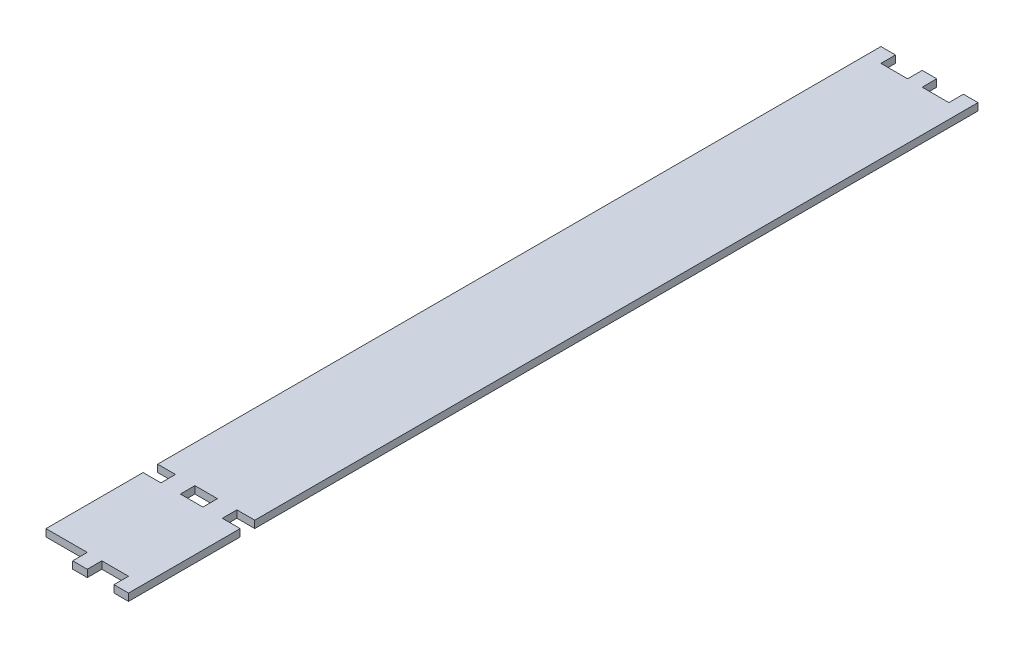
ISO-10303-21;
HEADER;
FILE_DESCRIPTION(('STEP AP214'),'2;1');
FILE_NAME('part.step','',(''),(''),'','','');
FILE_SCHEMA(('AUTOMOTIVE_DESIGN { 1 0 10303 214 1 1 1 1 }'));
ENDSEC;
DATA;
#1=APPLICATION_CONTEXT('core data for automotive mechanical design processes');
#2=APPLICATION_PROTOCOL_DEFINITION('international standard','automotive_design',2000,#1);
#3=PRODUCT_CONTEXT('',#1,'mechanical');
#4=PRODUCT('Part','Part','',(#3));
#5=PRODUCT_RELATED_PRODUCT_CATEGORY('part','',(#4));
#6=PRODUCT_DEFINITION_FORMATION('','',#4);
#7=PRODUCT_DEFINITION_CONTEXT('part definition',#1,'design');
#8=PRODUCT_DEFINITION('design','',#6,#7);
#9=PRODUCT_DEFINITION_SHAPE('','',#8);
#10=(LENGTH_UNIT() NAMED_UNIT(*) SI_UNIT(.MILLI.,.METRE.));
#11=(NAMED_UNIT(*) PLANE_ANGLE_UNIT() SI_UNIT($,.RADIAN.));
#12=(NAMED_UNIT(*) SI_UNIT($,.STERADIAN.) SOLID_ANGLE_UNIT());
#13=UNCERTAINTY_MEASURE_WITH_UNIT(LENGTH_MEASURE(1.E-05),#10,'distance_accuracy_value','');
#14=(GEOMETRIC_REPRESENTATION_CONTEXT(3) GLOBAL_UNCERTAINTY_ASSIGNED_CONTEXT((#13)) GLOBAL_UNIT_ASSIGNED_CONTEXT((#10,
#11,#12)) REPRESENTATION_CONTEXT('',''));
#15=CARTESIAN_POINT('',(0.,0.,0.));
#16=DIRECTION('',(0.,0.,1.));
#17=DIRECTION('',(1.,0.,0.));
#18=AXIS2_PLACEMENT_3D('',#15,#16,#17);
#19=CARTESIAN_POINT('',(0.,0.,0.));
#20=DIRECTION('',(0.,0.,-1.));
#21=DIRECTION('',(-1.,0.,0.));
#22=AXIS2_PLACEMENT_3D('',#19,#20,#21);
#23=PLANE('',#22);
#24=DIRECTION('',(0.,-1.,0.));
#25=VECTOR('',#24,1.);
#26=CARTESIAN_POINT('',(34.,3.,0.));
#27=LINE('',#26,#25);
#28=CARTESIAN_POINT('',(34.,3.,0.));
#29=VERTEX_POINT('',#28);
#30=CARTESIAN_POINT('',(34.,0.,0.));
#31=VERTEX_POINT('',#30);
#32=EDGE_CURVE('E256',#29,#31,#27,.T.);
#33=ORIENTED_EDGE('',*,*,#32,.T.);
#34=DIRECTION('',(1.,0.,0.));
#35=VECTOR('',#34,1.);
#36=CARTESIAN_POINT('',(0.,0.,0.));
#37=LINE('',#36,#35);
#38=CARTESIAN_POINT('',(23.,0.,0.));
#39=VERTEX_POINT('',#38);
#40=EDGE_CURVE('E286',#39,#31,#37,.T.);
#41=ORIENTED_EDGE('',*,*,#40,.F.);
#42=DIRECTION('',(0.,1.,0.));
#43=VECTOR('',#42,1.);
#44=CARTESIAN_POINT('',(23.,3.,0.));
#45=LINE('',#44,#43);
#46=CARTESIAN_POINT('',(23.,3.,0.));
#47=VERTEX_POINT('',#46);
#48=EDGE_CURVE('E863',#39,#47,#45,.T.);
#49=ORIENTED_EDGE('',*,*,#48,.T.);
#50=DIRECTION('',(-1.,0.,0.));
#51=VECTOR('',#50,1.);
#52=CARTESIAN_POINT('',(0.,3.,0.));
#53=LINE('',#52,#51);
#54=EDGE_CURVE('E41',#29,#47,#53,.T.);
#55=ORIENTED_EDGE('',*,*,#54,.F.);
#56=EDGE_LOOP('',(#33,#41,#49,#55));
#57=FACE_BOUND('',#56,.T.);
#58=ADVANCED_FACE('F37',(#57),#23,.T.);
#59=DIRECTION('',(0.,-1.,0.));
#60=VECTOR('',#59,1.);
#61=CARTESIAN_POINT('',(17.,3.,0.));
#62=LINE('',#61,#60);
#63=CARTESIAN_POINT('',(17.,3.,0.));
#64=VERTEX_POINT('',#63);
#65=CARTESIAN_POINT('',(17.,0.,0.));
#66=VERTEX_POINT('',#65);
#67=EDGE_CURVE('E55',#64,#66,#62,.T.);
#68=ORIENTED_EDGE('',*,*,#67,.T.);
#69=CARTESIAN_POINT('',(6.,0.,0.));
#70=VERTEX_POINT('',#69);
#71=EDGE_CURVE('E283',#70,#66,#37,.T.);
#72=ORIENTED_EDGE('',*,*,#71,.F.);
#73=DIRECTION('',(0.,1.,0.));
#74=VECTOR('',#73,1.);
#75=CARTESIAN_POINT('',(6.,3.,0.));
#76=LINE('',#75,#74);
#77=CARTESIAN_POINT('',(6.,3.,0.));
#78=VERTEX_POINT('',#77);
#79=EDGE_CURVE('E287',#70,#78,#76,.T.);
#80=ORIENTED_EDGE('',*,*,#79,.T.);
#81=EDGE_CURVE('E62',#64,#78,#53,.T.);
#82=ORIENTED_EDGE('',*,*,#81,.F.);
#83=EDGE_LOOP('',(#68,#72,#80,#82));
#84=FACE_BOUND('',#83,.T.);
#85=ADVANCED_FACE('F491',(#84),#23,.T.);
#86=CARTESIAN_POINT('',(0.,0.,338.));
#87=DIRECTION('',(0.,0.,-1.));
#88=DIRECTION('',(-1.,0.,0.));
#89=AXIS2_PLACEMENT_3D('',#86,#87,#88);
#90=PLANE('',#89);
#91=DIRECTION('',(0.,-1.,0.));
#92=VECTOR('',#91,1.);
#93=CARTESIAN_POINT('',(34.,3.,338.));
#94=LINE('',#93,#92);
#95=CARTESIAN_POINT('',(34.,3.,338.));
#96=VERTEX_POINT('',#95);
#97=CARTESIAN_POINT('',(34.,0.,338.));
#98=VERTEX_POINT('',#97);
#99=EDGE_CURVE('E304',#96,#98,#94,.T.);
#100=ORIENTED_EDGE('',*,*,#99,.F.);
#101=DIRECTION('',(-1.,0.,0.));
#102=VECTOR('',#101,1.);
#103=CARTESIAN_POINT('',(0.,3.,338.));
#104=LINE('',#103,#102);
#105=CARTESIAN_POINT('',(23.,3.,338.));
#106=VERTEX_POINT('',#105);
#107=EDGE_CURVE('E280',#96,#106,#104,.T.);
#108=ORIENTED_EDGE('',*,*,#107,.T.);
#109=DIRECTION('',(0.,1.,0.));
#110=VECTOR('',#109,1.);
#111=CARTESIAN_POINT('',(23.,3.,338.));
#112=LINE('',#111,#110);
#113=CARTESIAN_POINT('',(23.,0.,338.));
#114=VERTEX_POINT('',#113);
#115=EDGE_CURVE('E327',#114,#106,#112,.T.);
#116=ORIENTED_EDGE('',*,*,#115,.F.);
#117=DIRECTION('',(1.,0.,0.));
#118=VECTOR('',#117,1.);
#119=CARTESIAN_POINT('',(0.,0.,338.));
#120=LINE('',#119,#118);
#121=EDGE_CURVE('E249',#114,#98,#120,.T.);
#122=ORIENTED_EDGE('',*,*,#121,.T.);
#123=EDGE_LOOP('',(#100,#108,#116,#122));
#124=FACE_BOUND('',#123,.T.);
#125=ADVANCED_FACE('F489',(#124),#90,.F.);
#126=DIRECTION('',(0.,-1.,0.));
#127=VECTOR('',#126,1.);
#128=CARTESIAN_POINT('',(17.,3.,338.));
#129=LINE('',#128,#127);
#130=CARTESIAN_POINT('',(17.,3.,338.));
#131=VERTEX_POINT('',#130);
#132=CARTESIAN_POINT('',(17.,0.,338.));
#133=VERTEX_POINT('',#132);
#134=EDGE_CURVE('E332',#131,#133,#129,.T.);
#135=ORIENTED_EDGE('',*,*,#134,.F.);
#136=CARTESIAN_POINT('',(0.,3.,338.));
#137=VERTEX_POINT('',#136);
#138=EDGE_CURVE('E248',#131,#137,#104,.T.);
#139=ORIENTED_EDGE('',*,*,#138,.T.);
#140=DIRECTION('',(0.,-1.,0.));
#141=VECTOR('',#140,1.);
#142=CARTESIAN_POINT('',(0.,6.,338.));
#143=LINE('',#142,#141);
#144=CARTESIAN_POINT('',(0.,0.,338.));
#145=VERTEX_POINT('',#144);
#146=EDGE_CURVE('E252',#137,#145,#143,.T.);
#147=ORIENTED_EDGE('',*,*,#146,.T.);
#148=EDGE_CURVE('E235',#145,#133,#120,.T.);
#149=ORIENTED_EDGE('',*,*,#148,.T.);
#150=EDGE_LOOP('',(#135,#139,#147,#149));
#151=FACE_BOUND('',#150,.T.);
#152=ADVANCED_FACE('F253',(#151),#90,.F.);
#153=CARTESIAN_POINT('',(0.,0.,338.));
#154=DIRECTION('',(0.,1.,0.));
#155=DIRECTION('',(0.,0.,1.));
#156=AXIS2_PLACEMENT_3D('',#153,#154,#155);
#157=PLANE('',#156);
#158=DIRECTION('',(0.,0.,1.));
#159=VECTOR('',#158,1.);
#160=CARTESIAN_POINT('',(24.65,0.,338.));
#161=LINE('',#160,#159);
#162=CARTESIAN_POINT('',(24.65,0.,292.));
#163=VERTEX_POINT('',#162);
#164=CARTESIAN_POINT('',(24.65,0.,298.));
#165=VERTEX_POINT('',#164);
#166=EDGE_CURVE('E400',#163,#165,#161,.T.);
#167=ORIENTED_EDGE('',*,*,#166,.F.);
#168=DIRECTION('',(1.,0.,0.));
#169=VECTOR('',#168,1.);
#170=CARTESIAN_POINT('',(0.,0.,292.));
#171=LINE('',#170,#169);
#172=CARTESIAN_POINT('',(15.35,0.,292.));
#173=VERTEX_POINT('',#172);
#174=EDGE_CURVE('E386',#173,#163,#171,.T.);
#175=ORIENTED_EDGE('',*,*,#174,.F.);
#176=DIRECTION('',(0.,0.,1.));
#177=VECTOR('',#176,1.);
#178=CARTESIAN_POINT('',(15.35,0.,338.));
#179=LINE('',#178,#177);
#180=CARTESIAN_POINT('',(15.35,0.,298.));
#181=VERTEX_POINT('',#180);
#182=EDGE_CURVE('E394',#173,#181,#179,.T.);
#183=ORIENTED_EDGE('',*,*,#182,.T.);
#184=DIRECTION('',(1.,0.,0.));
#185=VECTOR('',#184,1.);
#186=CARTESIAN_POINT('',(0.,0.,298.));
#187=LINE('',#186,#185);
#188=EDGE_CURVE('E397',#181,#165,#187,.T.);
#189=ORIENTED_EDGE('',*,*,#188,.T.);
#190=EDGE_LOOP('',(#167,#175,#183,#189));
#191=FACE_BOUND('',#190,.T.);
#192=ORIENTED_EDGE('',*,*,#148,.F.);
#193=DIRECTION('',(0.,0.,-1.));
#194=VECTOR('',#193,1.);
#195=CARTESIAN_POINT('',(0.,0.,338.));
#196=LINE('',#195,#194);
#197=CARTESIAN_POINT('',(0.,0.,298.));
#198=VERTEX_POINT('',#197);
#199=EDGE_CURVE('E240',#145,#198,#196,.T.);
#200=ORIENTED_EDGE('',*,*,#199,.T.);
#201=DIRECTION('',(1.,0.,0.));
#202=VECTOR('',#201,1.);
#203=CARTESIAN_POINT('',(0.,0.,298.));
#204=LINE('',#203,#202);
#205=CARTESIAN_POINT('',(7.35,0.,298.));
#206=VERTEX_POINT('',#205);
#207=EDGE_CURVE('E421',#198,#206,#204,.T.);
#208=ORIENTED_EDGE('',*,*,#207,.T.);
#209=DIRECTION('',(0.,0.,1.));
#210=VECTOR('',#209,1.);
#211=CARTESIAN_POINT('',(7.35,0.,338.));
#212=LINE('',#211,#210);
#213=CARTESIAN_POINT('',(7.35,0.,292.));
#214=VERTEX_POINT('',#213);
#215=EDGE_CURVE('E274',#214,#206,#212,.T.);
#216=ORIENTED_EDGE('',*,*,#215,.F.);
#217=DIRECTION('',(1.,0.,0.));
#218=VECTOR('',#217,1.);
#219=CARTESIAN_POINT('',(0.,0.,292.));
#220=LINE('',#219,#218);
#221=CARTESIAN_POINT('',(0.,0.,292.));
#222=VERTEX_POINT('',#221);
#223=EDGE_CURVE('E414',#222,#214,#220,.T.);
#224=ORIENTED_EDGE('',*,*,#223,.F.);
#225=CARTESIAN_POINT('',(0.,0.,-6.));
#226=VERTEX_POINT('',#225);
#227=EDGE_CURVE('E261',#222,#226,#196,.T.);
#228=ORIENTED_EDGE('',*,*,#227,.T.);
#229=DIRECTION('',(1.,0.,0.));
#230=VECTOR('',#229,1.);
#231=CARTESIAN_POINT('',(0.,0.,-6.));
#232=LINE('',#231,#230);
#233=CARTESIAN_POINT('',(6.,0.,-6.));
#234=VERTEX_POINT('',#233);
#235=EDGE_CURVE('E302',#226,#234,#232,.T.);
#236=ORIENTED_EDGE('',*,*,#235,.T.);
#237=DIRECTION('',(0.,0.,1.));
#238=VECTOR('',#237,1.);
#239=CARTESIAN_POINT('',(6.,0.,-6.));
#240=LINE('',#239,#238);
#241=EDGE_CURVE('E299',#234,#70,#240,.T.);
#242=ORIENTED_EDGE('',*,*,#241,.T.);
#243=ORIENTED_EDGE('',*,*,#71,.T.);
#244=DIRECTION('',(0.,0.,1.));
#245=VECTOR('',#244,1.);
#246=CARTESIAN_POINT('',(17.,0.,-6.));
#247=LINE('',#246,#245);
#248=CARTESIAN_POINT('',(17.,0.,-6.));
#249=VERTEX_POINT('',#248);
#250=EDGE_CURVE('E884',#249,#66,#247,.T.);
#251=ORIENTED_EDGE('',*,*,#250,.F.);
#252=DIRECTION('',(1.,0.,0.));
#253=VECTOR('',#252,1.);
#254=CARTESIAN_POINT('',(17.,0.,-6.));
#255=LINE('',#254,#253);
#256=CARTESIAN_POINT('',(23.,0.,-6.));
#257=VERTEX_POINT('',#256);
#258=EDGE_CURVE('E867',#249,#257,#255,.T.);
#259=ORIENTED_EDGE('',*,*,#258,.T.);
#260=DIRECTION('',(0.,0.,1.));
#261=VECTOR('',#260,1.);
#262=CARTESIAN_POINT('',(23.,0.,-6.));
#263=LINE('',#262,#261);
#264=EDGE_CURVE('E886',#257,#39,#263,.T.);
#265=ORIENTED_EDGE('',*,*,#264,.T.);
#266=ORIENTED_EDGE('',*,*,#40,.T.);
#267=DIRECTION('',(0.,0.,1.));
#268=VECTOR('',#267,1.);
#269=CARTESIAN_POINT('',(34.,0.,-6.));
#270=LINE('',#269,#268);
#271=CARTESIAN_POINT('',(34.,0.,-6.));
#272=VERTEX_POINT('',#271);
#273=EDGE_CURVE('E859',#272,#31,#270,.T.);
#274=ORIENTED_EDGE('',*,*,#273,.F.);
#275=DIRECTION('',(1.,0.,0.));
#276=VECTOR('',#275,1.);
#277=CARTESIAN_POINT('',(34.,0.,-6.));
#278=LINE('',#277,#276);
#279=CARTESIAN_POINT('',(40.,0.,-6.));
#280=VERTEX_POINT('',#279);
#281=EDGE_CURVE('E849',#272,#280,#278,.T.);
#282=ORIENTED_EDGE('',*,*,#281,.T.);
#283=DIRECTION('',(0.,0.,-1.));
#284=VECTOR('',#283,1.);
#285=CARTESIAN_POINT('',(40.,0.,338.));
#286=LINE('',#285,#284);
#287=CARTESIAN_POINT('',(40.,0.,292.));
#288=VERTEX_POINT('',#287);
#289=EDGE_CURVE('E475',#288,#280,#286,.T.);
#290=ORIENTED_EDGE('',*,*,#289,.F.);
#291=DIRECTION('',(1.,0.,0.));
#292=VECTOR('',#291,1.);
#293=CARTESIAN_POINT('',(0.,0.,292.));
#294=LINE('',#293,#292);
#295=CARTESIAN_POINT('',(32.65,0.,292.));
#296=VERTEX_POINT('',#295);
#297=EDGE_CURVE('E366',#296,#288,#294,.T.);
#298=ORIENTED_EDGE('',*,*,#297,.F.);
#299=DIRECTION('',(0.,0.,1.));
#300=VECTOR('',#299,1.);
#301=CARTESIAN_POINT('',(32.65,0.,338.));
#302=LINE('',#301,#300);
#303=CARTESIAN_POINT('',(32.65,0.,298.));
#304=VERTEX_POINT('',#303);
#305=EDGE_CURVE('E368',#296,#304,#302,.T.);
#306=ORIENTED_EDGE('',*,*,#305,.T.);
#307=DIRECTION('',(1.,0.,0.));
#308=VECTOR('',#307,1.);
#309=CARTESIAN_POINT('',(0.,0.,298.));
#310=LINE('',#309,#308);
#311=CARTESIAN_POINT('',(40.,0.,298.));
#312=VERTEX_POINT('',#311);
#313=EDGE_CURVE('E362',#304,#312,#310,.T.);
#314=ORIENTED_EDGE('',*,*,#313,.T.);
#315=CARTESIAN_POINT('',(40.,0.,344.));
#316=VERTEX_POINT('',#315);
#317=EDGE_CURVE('E265',#316,#312,#286,.T.);
#318=ORIENTED_EDGE('',*,*,#317,.F.);
#319=DIRECTION('',(1.,0.,0.));
#320=VECTOR('',#319,1.);
#321=CARTESIAN_POINT('',(34.,0.,344.));
#322=LINE('',#321,#320);
#323=CARTESIAN_POINT('',(34.,0.,344.));
#324=VERTEX_POINT('',#323);
#325=EDGE_CURVE('E316',#324,#316,#322,.T.);
#326=ORIENTED_EDGE('',*,*,#325,.F.);
#327=DIRECTION('',(0.,0.,-1.));
#328=VECTOR('',#327,1.);
#329=CARTESIAN_POINT('',(34.,0.,344.));
#330=LINE('',#329,#328);
#331=EDGE_CURVE('E324',#324,#98,#330,.T.);
#332=ORIENTED_EDGE('',*,*,#331,.T.);
#333=ORIENTED_EDGE('',*,*,#121,.F.);
#334=DIRECTION('',(0.,0.,-1.));
#335=VECTOR('',#334,1.);
#336=CARTESIAN_POINT('',(23.,0.,344.));
#337=LINE('',#336,#335);
#338=CARTESIAN_POINT('',(23.,0.,344.));
#339=VERTEX_POINT('',#338);
#340=EDGE_CURVE('E338',#339,#114,#337,.T.);
#341=ORIENTED_EDGE('',*,*,#340,.F.);
#342=DIRECTION('',(1.,0.,0.));
#343=VECTOR('',#342,1.);
#344=CARTESIAN_POINT('',(17.,0.,344.));
#345=LINE('',#344,#343);
#346=CARTESIAN_POINT('',(17.,0.,344.));
#347=VERTEX_POINT('',#346);
#348=EDGE_CURVE('E336',#347,#339,#345,.T.);
#349=ORIENTED_EDGE('',*,*,#348,.F.);
#350=DIRECTION('',(0.,0.,-1.));
#351=VECTOR('',#350,1.);
#352=CARTESIAN_POINT('',(17.,0.,344.));
#353=LINE('',#352,#351);
#354=EDGE_CURVE('E244',#347,#133,#353,.T.);
#355=ORIENTED_EDGE('',*,*,#354,.T.);
#356=EDGE_LOOP('',(#192,#200,#208,#216,#224,#228,#236,#242,#243,#251,#259,#265,#266,#274,#282,
#290,#298,#306,#314,#318,#326,#332,#333,#341,#349,#355));
#357=FACE_BOUND('',#356,.T.);
#358=ADVANCED_FACE('F237',(#191,#357),#157,.F.);
#359=CARTESIAN_POINT('',(0.,3.,338.));
#360=DIRECTION('',(0.,-1.,0.));
#361=DIRECTION('',(0.,0.,-1.));
#362=AXIS2_PLACEMENT_3D('',#359,#360,#361);
#363=PLANE('',#362);
#364=DIRECTION('',(0.,0.,1.));
#365=VECTOR('',#364,1.);
#366=CARTESIAN_POINT('',(24.65,3.,0.));
#367=LINE('',#366,#365);
#368=CARTESIAN_POINT('',(24.65,3.,292.));
#369=VERTEX_POINT('',#368);
#370=CARTESIAN_POINT('',(24.65,3.,298.));
#371=VERTEX_POINT('',#370);
#372=EDGE_CURVE('E371',#369,#371,#367,.T.);
#373=ORIENTED_EDGE('',*,*,#372,.T.);
#374=DIRECTION('',(1.,0.,0.));
#375=VECTOR('',#374,1.);
#376=CARTESIAN_POINT('',(0.,3.,298.));
#377=LINE('',#376,#375);
#378=CARTESIAN_POINT('',(15.35,3.,298.));
#379=VERTEX_POINT('',#378);
#380=EDGE_CURVE('E380',#379,#371,#377,.T.);
#381=ORIENTED_EDGE('',*,*,#380,.F.);
#382=DIRECTION('',(0.,0.,1.));
#383=VECTOR('',#382,1.);
#384=CARTESIAN_POINT('',(15.35,3.,0.));
#385=LINE('',#384,#383);
#386=CARTESIAN_POINT('',(15.35,3.,292.));
#387=VERTEX_POINT('',#386);
#388=EDGE_CURVE('E377',#387,#379,#385,.T.);
#389=ORIENTED_EDGE('',*,*,#388,.F.);
#390=DIRECTION('',(1.,0.,0.));
#391=VECTOR('',#390,1.);
#392=CARTESIAN_POINT('',(0.,3.,292.));
#393=LINE('',#392,#391);
#394=EDGE_CURVE('E374',#387,#369,#393,.T.);
#395=ORIENTED_EDGE('',*,*,#394,.T.);
#396=EDGE_LOOP('',(#373,#381,#389,#395));
#397=FACE_BOUND('',#396,.T.);
#398=DIRECTION('',(0.,0.,-1.));
#399=VECTOR('',#398,1.);
#400=CARTESIAN_POINT('',(0.,3.,338.));
#401=LINE('',#400,#399);
#402=CARTESIAN_POINT('',(0.,3.,298.));
#403=VERTEX_POINT('',#402);
#404=EDGE_CURVE('E477',#137,#403,#401,.T.);
#405=ORIENTED_EDGE('',*,*,#404,.F.);
#406=ORIENTED_EDGE('',*,*,#138,.F.);
#407=DIRECTION('',(0.,0.,-1.));
#408=VECTOR('',#407,1.);
#409=CARTESIAN_POINT('',(17.,3.,344.));
#410=LINE('',#409,#408);
#411=CARTESIAN_POINT('',(17.,3.,344.));
#412=VERTEX_POINT('',#411);
#413=EDGE_CURVE('E345',#412,#131,#410,.T.);
#414=ORIENTED_EDGE('',*,*,#413,.F.);
#415=DIRECTION('',(-1.,0.,0.));
#416=VECTOR('',#415,1.);
#417=CARTESIAN_POINT('',(23.,3.,344.));
#418=LINE('',#417,#416);
#419=CARTESIAN_POINT('',(23.,3.,344.));
#420=VERTEX_POINT('',#419);
#421=EDGE_CURVE('E331',#420,#412,#418,.T.);
#422=ORIENTED_EDGE('',*,*,#421,.F.);
#423=DIRECTION('',(0.,0.,-1.));
#424=VECTOR('',#423,1.);
#425=CARTESIAN_POINT('',(23.,3.,344.));
#426=LINE('',#425,#424);
#427=EDGE_CURVE('E348',#420,#106,#426,.T.);
#428=ORIENTED_EDGE('',*,*,#427,.T.);
#429=ORIENTED_EDGE('',*,*,#107,.F.);
#430=DIRECTION('',(0.,0.,-1.));
#431=VECTOR('',#430,1.);
#432=CARTESIAN_POINT('',(34.,3.,344.));
#433=LINE('',#432,#431);
#434=CARTESIAN_POINT('',(34.,3.,344.));
#435=VERTEX_POINT('',#434);
#436=EDGE_CURVE('E322',#435,#96,#433,.T.);
#437=ORIENTED_EDGE('',*,*,#436,.F.);
#438=DIRECTION('',(-1.,0.,0.));
#439=VECTOR('',#438,1.);
#440=CARTESIAN_POINT('',(34.,3.,344.));
#441=LINE('',#440,#439);
#442=CARTESIAN_POINT('',(40.,3.,344.));
#443=VERTEX_POINT('',#442);
#444=EDGE_CURVE('E320',#443,#435,#441,.T.);
#445=ORIENTED_EDGE('',*,*,#444,.F.);
#446=DIRECTION('',(0.,0.,-1.));
#447=VECTOR('',#446,1.);
#448=CARTESIAN_POINT('',(40.,3.,338.));
#449=LINE('',#448,#447);
#450=CARTESIAN_POINT('',(40.,3.,298.));
#451=VERTEX_POINT('',#450);
#452=EDGE_CURVE('E473',#443,#451,#449,.T.);
#453=ORIENTED_EDGE('',*,*,#452,.T.);
#454=DIRECTION('',(1.,0.,0.));
#455=VECTOR('',#454,1.);
#456=CARTESIAN_POINT('',(0.,3.,298.));
#457=LINE('',#456,#455);
#458=CARTESIAN_POINT('',(32.65,3.,298.));
#459=VERTEX_POINT('',#458);
#460=EDGE_CURVE('E357',#459,#451,#457,.T.);
#461=ORIENTED_EDGE('',*,*,#460,.F.);
#462=DIRECTION('',(0.,0.,1.));
#463=VECTOR('',#462,1.);
#464=CARTESIAN_POINT('',(32.6499999999997,3.,0.));
#465=LINE('',#464,#463);
#466=CARTESIAN_POINT('',(32.65,3.,292.));
#467=VERTEX_POINT('',#466);
#468=EDGE_CURVE('E354',#467,#459,#465,.T.);
#469=ORIENTED_EDGE('',*,*,#468,.F.);
#470=DIRECTION('',(1.,0.,0.));
#471=VECTOR('',#470,1.);
#472=CARTESIAN_POINT('',(0.,3.,292.));
#473=LINE('',#472,#471);
#474=CARTESIAN_POINT('',(40.,3.,292.));
#475=VERTEX_POINT('',#474);
#476=EDGE_CURVE('E351',#467,#475,#473,.T.);
#477=ORIENTED_EDGE('',*,*,#476,.T.);
#478=CARTESIAN_POINT('',(40.,3.,-6.));
#479=VERTEX_POINT('',#478);
#480=EDGE_CURVE('E476',#475,#479,#449,.T.);
#481=ORIENTED_EDGE('',*,*,#480,.T.);
#482=DIRECTION('',(-1.,0.,0.));
#483=VECTOR('',#482,1.);
#484=CARTESIAN_POINT('',(34.,3.,-6.));
#485=LINE('',#484,#483);
#486=CARTESIAN_POINT('',(34.,3.,-6.));
#487=VERTEX_POINT('',#486);
#488=EDGE_CURVE('E846',#479,#487,#485,.T.);
#489=ORIENTED_EDGE('',*,*,#488,.T.);
#490=DIRECTION('',(0.,0.,1.));
#491=VECTOR('',#490,1.);
#492=CARTESIAN_POINT('',(34.,3.,-6.));
#493=LINE('',#492,#491);
#494=EDGE_CURVE('E851',#487,#29,#493,.T.);
#495=ORIENTED_EDGE('',*,*,#494,.T.);
#496=ORIENTED_EDGE('',*,*,#54,.T.);
#497=DIRECTION('',(0.,0.,1.));
#498=VECTOR('',#497,1.);
#499=CARTESIAN_POINT('',(23.,3.,-6.));
#500=LINE('',#499,#498);
#501=CARTESIAN_POINT('',(23.,3.,-6.));
#502=VERTEX_POINT('',#501);
#503=EDGE_CURVE('E876',#502,#47,#500,.T.);
#504=ORIENTED_EDGE('',*,*,#503,.F.);
#505=DIRECTION('',(-1.,0.,0.));
#506=VECTOR('',#505,1.);
#507=CARTESIAN_POINT('',(23.,3.,-6.));
#508=LINE('',#507,#506);
#509=CARTESIAN_POINT('',(17.,3.,-6.));
#510=VERTEX_POINT('',#509);
#511=EDGE_CURVE('E873',#502,#510,#508,.T.);
#512=ORIENTED_EDGE('',*,*,#511,.T.);
#513=DIRECTION('',(0.,0.,1.));
#514=VECTOR('',#513,1.);
#515=CARTESIAN_POINT('',(17.,3.,-6.));
#516=LINE('',#515,#514);
#517=EDGE_CURVE('E882',#510,#64,#516,.T.);
#518=ORIENTED_EDGE('',*,*,#517,.T.);
#519=ORIENTED_EDGE('',*,*,#81,.T.);
#520=DIRECTION('',(0.,0.,1.));
#521=VECTOR('',#520,1.);
#522=CARTESIAN_POINT('',(6.,3.,-6.));
#523=LINE('',#522,#521);
#524=CARTESIAN_POINT('',(6.,3.,-6.));
#525=VERTEX_POINT('',#524);
#526=EDGE_CURVE('E301',#525,#78,#523,.T.);
#527=ORIENTED_EDGE('',*,*,#526,.F.);
#528=DIRECTION('',(-1.,0.,0.));
#529=VECTOR('',#528,1.);
#530=CARTESIAN_POINT('',(0.,3.,-6.));
#531=LINE('',#530,#529);
#532=CARTESIAN_POINT('',(0.,3.,-6.));
#533=VERTEX_POINT('',#532);
#534=EDGE_CURVE('E446',#525,#533,#531,.T.);
#535=ORIENTED_EDGE('',*,*,#534,.T.);
#536=CARTESIAN_POINT('',(0.,3.,292.));
#537=VERTEX_POINT('',#536);
#538=EDGE_CURVE('E282',#537,#533,#401,.T.);
#539=ORIENTED_EDGE('',*,*,#538,.F.);
#540=DIRECTION('',(1.,0.,0.));
#541=VECTOR('',#540,1.);
#542=CARTESIAN_POINT('',(0.,3.,292.));
#543=LINE('',#542,#541);
#544=CARTESIAN_POINT('',(7.35,3.,292.));
#545=VERTEX_POINT('',#544);
#546=EDGE_CURVE('E405',#537,#545,#543,.T.);
#547=ORIENTED_EDGE('',*,*,#546,.T.);
#548=DIRECTION('',(0.,0.,1.));
#549=VECTOR('',#548,1.);
#550=CARTESIAN_POINT('',(7.35,3.,0.));
#551=LINE('',#550,#549);
#552=CARTESIAN_POINT('',(7.35,3.,298.));
#553=VERTEX_POINT('',#552);
#554=EDGE_CURVE('E402',#545,#553,#551,.T.);
#555=ORIENTED_EDGE('',*,*,#554,.T.);
#556=DIRECTION('',(1.,0.,0.));
#557=VECTOR('',#556,1.);
#558=CARTESIAN_POINT('',(0.,3.,298.));
#559=LINE('',#558,#557);
#560=EDGE_CURVE('E408',#403,#553,#559,.T.);
#561=ORIENTED_EDGE('',*,*,#560,.F.);
#562=EDGE_LOOP('',(#405,#406,#414,#422,#428,#429,#437,#445,#453,#461,#469,#477,#481,#489,#495,
#496,#504,#512,#518,#519,#527,#535,#539,#547,#555,#561));
#563=FACE_BOUND('',#562,.T.);
#564=ADVANCED_FACE('F431',(#397,#563),#363,.F.);
#565=CARTESIAN_POINT('',(40.,0.,338.));
#566=DIRECTION('',(-1.,0.,0.));
#567=DIRECTION('',(0.,0.,1.));
#568=AXIS2_PLACEMENT_3D('',#565,#566,#567);
#569=PLANE('',#568);
#570=DIRECTION('',(0.,1.,0.));
#571=VECTOR('',#570,1.);
#572=CARTESIAN_POINT('',(40.,0.,292.));
#573=LINE('',#572,#571);
#574=EDGE_CURVE('E11',#288,#475,#573,.T.);
#575=ORIENTED_EDGE('',*,*,#574,.F.);
#576=ORIENTED_EDGE('',*,*,#289,.T.);
#577=DIRECTION('',(0.,1.,0.));
#578=VECTOR('',#577,1.);
#579=CARTESIAN_POINT('',(40.,3.,-6.));
#580=LINE('',#579,#578);
#581=EDGE_CURVE('E854',#280,#479,#580,.T.);
#582=ORIENTED_EDGE('',*,*,#581,.T.);
#583=ORIENTED_EDGE('',*,*,#480,.F.);
#584=EDGE_LOOP('',(#575,#576,#582,#583));
#585=FACE_BOUND('',#584,.T.);
#586=ADVANCED_FACE('F508',(#585),#569,.F.);
#587=CARTESIAN_POINT('',(0.,0.,338.));
#588=DIRECTION('',(1.,0.,0.));
#589=DIRECTION('',(0.,0.,-1.));
#590=AXIS2_PLACEMENT_3D('',#587,#588,#589);
#591=PLANE('',#590);
#592=DIRECTION('',(0.,1.,0.));
#593=VECTOR('',#592,1.);
#594=CARTESIAN_POINT('',(0.,-3.,292.));
#595=LINE('',#594,#593);
#596=EDGE_CURVE('E416',#222,#537,#595,.T.);
#597=ORIENTED_EDGE('',*,*,#596,.T.);
#598=ORIENTED_EDGE('',*,*,#538,.T.);
#599=DIRECTION('',(0.,-1.,0.));
#600=VECTOR('',#599,1.);
#601=CARTESIAN_POINT('',(0.,3.,-6.));
#602=LINE('',#601,#600);
#603=EDGE_CURVE('E441',#533,#226,#602,.T.);
#604=ORIENTED_EDGE('',*,*,#603,.T.);
#605=ORIENTED_EDGE('',*,*,#227,.F.);
#606=EDGE_LOOP('',(#597,#598,#604,#605));
#607=FACE_BOUND('',#606,.T.);
#608=ADVANCED_FACE('F439',(#607),#591,.F.);
#609=ORIENTED_EDGE('',*,*,#199,.F.);
#610=ORIENTED_EDGE('',*,*,#146,.F.);
#611=ORIENTED_EDGE('',*,*,#404,.T.);
#612=DIRECTION('',(0.,1.,0.));
#613=VECTOR('',#612,1.);
#614=CARTESIAN_POINT('',(0.,-3.,298.));
#615=LINE('',#614,#613);
#616=EDGE_CURVE('E260',#198,#403,#615,.T.);
#617=ORIENTED_EDGE('',*,*,#616,.F.);
#618=EDGE_LOOP('',(#609,#610,#611,#617));
#619=FACE_BOUND('',#618,.T.);
#620=ADVANCED_FACE('F39',(#619),#591,.F.);
#621=ORIENTED_EDGE('',*,*,#317,.T.);
#622=DIRECTION('',(0.,1.,0.));
#623=VECTOR('',#622,1.);
#624=CARTESIAN_POINT('',(40.,0.,298.));
#625=LINE('',#624,#623);
#626=EDGE_CURVE('E47',#312,#451,#625,.T.);
#627=ORIENTED_EDGE('',*,*,#626,.T.);
#628=ORIENTED_EDGE('',*,*,#452,.F.);
#629=DIRECTION('',(0.,1.,0.));
#630=VECTOR('',#629,1.);
#631=CARTESIAN_POINT('',(40.,3.,344.));
#632=LINE('',#631,#630);
#633=EDGE_CURVE('E457',#316,#443,#632,.T.);
#634=ORIENTED_EDGE('',*,*,#633,.F.);
#635=EDGE_LOOP('',(#621,#627,#628,#634));
#636=FACE_BOUND('',#635,.T.);
#637=ADVANCED_FACE('F472',(#636),#569,.F.);
#638=CARTESIAN_POINT('',(7.35,-3.,0.));
#639=DIRECTION('',(-1.,0.,0.));
#640=DIRECTION('',(0.,0.,1.));
#641=AXIS2_PLACEMENT_3D('',#638,#639,#640);
#642=PLANE('',#641);
#643=ORIENTED_EDGE('',*,*,#215,.T.);
#644=DIRECTION('',(0.,1.,0.));
#645=VECTOR('',#644,1.);
#646=CARTESIAN_POINT('',(7.35,-3.,298.));
#647=LINE('',#646,#645);
#648=EDGE_CURVE('E412',#206,#553,#647,.T.);
#649=ORIENTED_EDGE('',*,*,#648,.T.);
#650=ORIENTED_EDGE('',*,*,#554,.F.);
#651=DIRECTION('',(0.,1.,0.));
#652=VECTOR('',#651,1.);
#653=CARTESIAN_POINT('',(7.35,-3.,292.));
#654=LINE('',#653,#652);
#655=EDGE_CURVE('E411',#214,#545,#654,.T.);
#656=ORIENTED_EDGE('',*,*,#655,.F.);
#657=EDGE_LOOP('',(#643,#649,#650,#656));
#658=FACE_BOUND('',#657,.T.);
#659=ADVANCED_FACE('F426',(#658),#642,.T.);
#660=CARTESIAN_POINT('',(0.,-3.,298.));
#661=DIRECTION('',(0.,0.,1.));
#662=DIRECTION('',(1.,0.,0.));
#663=AXIS2_PLACEMENT_3D('',#660,#661,#662);
#664=PLANE('',#663);
#665=ORIENTED_EDGE('',*,*,#616,.T.);
#666=ORIENTED_EDGE('',*,*,#560,.T.);
#667=ORIENTED_EDGE('',*,*,#648,.F.);
#668=ORIENTED_EDGE('',*,*,#207,.F.);
#669=EDGE_LOOP('',(#665,#666,#667,#668));
#670=FACE_BOUND('',#669,.T.);
#671=ADVANCED_FACE('F429',(#670),#664,.F.);
#672=CARTESIAN_POINT('',(0.,-3.,292.));
#673=DIRECTION('',(0.,0.,1.));
#674=DIRECTION('',(1.,0.,0.));
#675=AXIS2_PLACEMENT_3D('',#672,#673,#674);
#676=PLANE('',#675);
#677=ORIENTED_EDGE('',*,*,#223,.T.);
#678=ORIENTED_EDGE('',*,*,#655,.T.);
#679=ORIENTED_EDGE('',*,*,#546,.F.);
#680=ORIENTED_EDGE('',*,*,#596,.F.);
#681=EDGE_LOOP('',(#677,#678,#679,#680));
#682=FACE_BOUND('',#681,.T.);
#683=ADVANCED_FACE('F434',(#682),#676,.T.);
#684=CARTESIAN_POINT('',(24.65,-3.,0.));
#685=DIRECTION('',(-1.,0.,0.));
#686=DIRECTION('',(0.,0.,1.));
#687=AXIS2_PLACEMENT_3D('',#684,#685,#686);
#688=PLANE('',#687);
#689=ORIENTED_EDGE('',*,*,#166,.T.);
#690=DIRECTION('',(0.,1.,0.));
#691=VECTOR('',#690,1.);
#692=CARTESIAN_POINT('',(24.65,-3.,298.));
#693=LINE('',#692,#691);
#694=EDGE_CURVE('E384',#165,#371,#693,.T.);
#695=ORIENTED_EDGE('',*,*,#694,.T.);
#696=ORIENTED_EDGE('',*,*,#372,.F.);
#697=DIRECTION('',(0.,1.,0.));
#698=VECTOR('',#697,1.);
#699=CARTESIAN_POINT('',(24.65,-3.,292.));
#700=LINE('',#699,#698);
#701=EDGE_CURVE('E383',#163,#369,#700,.T.);
#702=ORIENTED_EDGE('',*,*,#701,.F.);
#703=EDGE_LOOP('',(#689,#695,#696,#702));
#704=FACE_BOUND('',#703,.T.);
#705=ADVANCED_FACE('F520',(#704),#688,.T.);
#706=CARTESIAN_POINT('',(0.,-3.,298.));
#707=DIRECTION('',(0.,0.,1.));
#708=DIRECTION('',(1.,0.,0.));
#709=AXIS2_PLACEMENT_3D('',#706,#707,#708);
#710=PLANE('',#709);
#711=DIRECTION('',(0.,1.,0.));
#712=VECTOR('',#711,1.);
#713=CARTESIAN_POINT('',(15.35,-3.,298.));
#714=LINE('',#713,#712);
#715=EDGE_CURVE('E387',#181,#379,#714,.T.);
#716=ORIENTED_EDGE('',*,*,#715,.T.);
#717=ORIENTED_EDGE('',*,*,#380,.T.);
#718=ORIENTED_EDGE('',*,*,#694,.F.);
#719=ORIENTED_EDGE('',*,*,#188,.F.);
#720=EDGE_LOOP('',(#716,#717,#718,#719));
#721=FACE_BOUND('',#720,.T.);
#722=ADVANCED_FACE('F522',(#721),#710,.F.);
#723=CARTESIAN_POINT('',(15.35,-3.,0.));
#724=DIRECTION('',(-1.,0.,0.));
#725=DIRECTION('',(0.,0.,1.));
#726=AXIS2_PLACEMENT_3D('',#723,#724,#725);
#727=PLANE('',#726);
#728=DIRECTION('',(0.,1.,0.));
#729=VECTOR('',#728,1.);
#730=CARTESIAN_POINT('',(15.35,-3.,292.));
#731=LINE('',#730,#729);
#732=EDGE_CURVE('E389',#173,#387,#731,.T.);
#733=ORIENTED_EDGE('',*,*,#732,.T.);
#734=ORIENTED_EDGE('',*,*,#388,.T.);
#735=ORIENTED_EDGE('',*,*,#715,.F.);
#736=ORIENTED_EDGE('',*,*,#182,.F.);
#737=EDGE_LOOP('',(#733,#734,#735,#736));
#738=FACE_BOUND('',#737,.T.);
#739=ADVANCED_FACE('F531',(#738),#727,.F.);
#740=CARTESIAN_POINT('',(0.,-3.,292.));
#741=DIRECTION('',(0.,0.,1.));
#742=DIRECTION('',(1.,0.,0.));
#743=AXIS2_PLACEMENT_3D('',#740,#741,#742);
#744=PLANE('',#743);
#745=ORIENTED_EDGE('',*,*,#174,.T.);
#746=ORIENTED_EDGE('',*,*,#701,.T.);
#747=ORIENTED_EDGE('',*,*,#394,.F.);
#748=ORIENTED_EDGE('',*,*,#732,.F.);
#749=EDGE_LOOP('',(#745,#746,#747,#748));
#750=FACE_BOUND('',#749,.T.);
#751=ADVANCED_FACE('F528',(#750),#744,.T.);
#752=CARTESIAN_POINT('',(32.6499999999997,-3.,0.));
#753=DIRECTION('',(-1.,0.,0.));
#754=DIRECTION('',(0.,0.,1.));
#755=AXIS2_PLACEMENT_3D('',#752,#753,#754);
#756=PLANE('',#755);
#757=DIRECTION('',(0.,1.,0.));
#758=VECTOR('',#757,1.);
#759=CARTESIAN_POINT('',(32.65,-3.,292.));
#760=LINE('',#759,#758);
#761=EDGE_CURVE('E359',#296,#467,#760,.T.);
#762=ORIENTED_EDGE('',*,*,#761,.T.);
#763=ORIENTED_EDGE('',*,*,#468,.T.);
#764=DIRECTION('',(0.,1.,0.));
#765=VECTOR('',#764,1.);
#766=CARTESIAN_POINT('',(32.65,-3.,298.));
#767=LINE('',#766,#765);
#768=EDGE_CURVE('E360',#304,#459,#767,.T.);
#769=ORIENTED_EDGE('',*,*,#768,.F.);
#770=ORIENTED_EDGE('',*,*,#305,.F.);
#771=EDGE_LOOP('',(#762,#763,#769,#770));
#772=FACE_BOUND('',#771,.T.);
#773=ADVANCED_FACE('F538',(#772),#756,.F.);
#774=CARTESIAN_POINT('',(0.,-3.,292.));
#775=DIRECTION('',(0.,0.,1.));
#776=DIRECTION('',(1.,0.,0.));
#777=AXIS2_PLACEMENT_3D('',#774,#775,#776);
#778=PLANE('',#777);
#779=ORIENTED_EDGE('',*,*,#297,.T.);
#780=ORIENTED_EDGE('',*,*,#574,.T.);
#781=ORIENTED_EDGE('',*,*,#476,.F.);
#782=ORIENTED_EDGE('',*,*,#761,.F.);
#783=EDGE_LOOP('',(#779,#780,#781,#782));
#784=FACE_BOUND('',#783,.T.);
#785=ADVANCED_FACE('F590',(#784),#778,.T.);
#786=CARTESIAN_POINT('',(0.,-3.,298.));
#787=DIRECTION('',(0.,0.,1.));
#788=DIRECTION('',(1.,0.,0.));
#789=AXIS2_PLACEMENT_3D('',#786,#787,#788);
#790=PLANE('',#789);
#791=ORIENTED_EDGE('',*,*,#768,.T.);
#792=ORIENTED_EDGE('',*,*,#460,.T.);
#793=ORIENTED_EDGE('',*,*,#626,.F.);
#794=ORIENTED_EDGE('',*,*,#313,.F.);
#795=EDGE_LOOP('',(#791,#792,#793,#794));
#796=FACE_BOUND('',#795,.T.);
#797=ADVANCED_FACE('F601',(#796),#790,.F.);
#798=CARTESIAN_POINT('',(23.,3.,344.));
#799=DIRECTION('',(-1.,0.,0.));
#800=DIRECTION('',(0.,0.,1.));
#801=AXIS2_PLACEMENT_3D('',#798,#799,#800);
#802=PLANE('',#801);
#803=ORIENTED_EDGE('',*,*,#115,.T.);
#804=ORIENTED_EDGE('',*,*,#427,.F.);
#805=DIRECTION('',(0.,1.,0.));
#806=VECTOR('',#805,1.);
#807=CARTESIAN_POINT('',(23.,3.,344.));
#808=LINE('',#807,#806);
#809=EDGE_CURVE('E328',#339,#420,#808,.T.);
#810=ORIENTED_EDGE('',*,*,#809,.F.);
#811=ORIENTED_EDGE('',*,*,#340,.T.);
#812=EDGE_LOOP('',(#803,#804,#810,#811));
#813=FACE_BOUND('',#812,.T.);
#814=ADVANCED_FACE('F487',(#813),#802,.F.);
#815=CARTESIAN_POINT('',(17.,3.,344.));
#816=DIRECTION('',(1.,0.,0.));
#817=DIRECTION('',(0.,0.,-1.));
#818=AXIS2_PLACEMENT_3D('',#815,#816,#817);
#819=PLANE('',#818);
#820=ORIENTED_EDGE('',*,*,#134,.T.);
#821=ORIENTED_EDGE('',*,*,#354,.F.);
#822=DIRECTION('',(0.,-1.,0.));
#823=VECTOR('',#822,1.);
#824=CARTESIAN_POINT('',(17.,3.,344.));
#825=LINE('',#824,#823);
#826=EDGE_CURVE('E334',#412,#347,#825,.T.);
#827=ORIENTED_EDGE('',*,*,#826,.F.);
#828=ORIENTED_EDGE('',*,*,#413,.T.);
#829=EDGE_LOOP('',(#820,#821,#827,#828));
#830=FACE_BOUND('',#829,.T.);
#831=ADVANCED_FACE('F481',(#830),#819,.F.);
#832=CARTESIAN_POINT('',(0.,0.,344.));
#833=DIRECTION('',(0.,0.,1.));
#834=DIRECTION('',(1.,0.,0.));
#835=AXIS2_PLACEMENT_3D('',#832,#833,#834);
#836=PLANE('',#835);
#837=ORIENTED_EDGE('',*,*,#809,.T.);
#838=ORIENTED_EDGE('',*,*,#421,.T.);
#839=ORIENTED_EDGE('',*,*,#826,.T.);
#840=ORIENTED_EDGE('',*,*,#348,.T.);
#841=EDGE_LOOP('',(#837,#838,#839,#840));
#842=FACE_BOUND('',#841,.T.);
#843=ADVANCED_FACE('F483',(#842),#836,.T.);
#844=CARTESIAN_POINT('',(34.,3.,344.));
#845=DIRECTION('',(1.,0.,0.));
#846=DIRECTION('',(0.,0.,-1.));
#847=AXIS2_PLACEMENT_3D('',#844,#845,#846);
#848=PLANE('',#847);
#849=ORIENTED_EDGE('',*,*,#99,.T.);
#850=ORIENTED_EDGE('',*,*,#331,.F.);
#851=DIRECTION('',(0.,-1.,0.));
#852=VECTOR('',#851,1.);
#853=CARTESIAN_POINT('',(34.,3.,344.));
#854=LINE('',#853,#852);
#855=EDGE_CURVE('E310',#435,#324,#854,.T.);
#856=ORIENTED_EDGE('',*,*,#855,.F.);
#857=ORIENTED_EDGE('',*,*,#436,.T.);
#858=EDGE_LOOP('',(#849,#850,#856,#857));
#859=FACE_BOUND('',#858,.T.);
#860=ADVANCED_FACE('F467',(#859),#848,.F.);
#861=CARTESIAN_POINT('',(0.,0.,344.));
#862=DIRECTION('',(0.,0.,1.));
#863=DIRECTION('',(1.,0.,0.));
#864=AXIS2_PLACEMENT_3D('',#861,#862,#863);
#865=PLANE('',#864);
#866=ORIENTED_EDGE('',*,*,#855,.T.);
#867=ORIENTED_EDGE('',*,*,#325,.T.);
#868=ORIENTED_EDGE('',*,*,#633,.T.);
#869=ORIENTED_EDGE('',*,*,#444,.T.);
#870=EDGE_LOOP('',(#866,#867,#868,#869));
#871=FACE_BOUND('',#870,.T.);
#872=ADVANCED_FACE('F463',(#871),#865,.T.);
#873=CARTESIAN_POINT('',(6.,3.,-6.));
#874=DIRECTION('',(1.,0.,0.));
#875=DIRECTION('',(0.,0.,-1.));
#876=AXIS2_PLACEMENT_3D('',#873,#874,#875);
#877=PLANE('',#876);
#878=ORIENTED_EDGE('',*,*,#79,.F.);
#879=ORIENTED_EDGE('',*,*,#241,.F.);
#880=DIRECTION('',(0.,1.,0.));
#881=VECTOR('',#880,1.);
#882=CARTESIAN_POINT('',(6.,3.,-6.));
#883=LINE('',#882,#881);
#884=EDGE_CURVE('E450',#234,#525,#883,.T.);
#885=ORIENTED_EDGE('',*,*,#884,.T.);
#886=ORIENTED_EDGE('',*,*,#526,.T.);
#887=EDGE_LOOP('',(#878,#879,#885,#886));
#888=FACE_BOUND('',#887,.T.);
#889=ADVANCED_FACE('F662',(#888),#877,.T.);
#890=CARTESIAN_POINT('',(0.,0.,-6.));
#891=DIRECTION('',(0.,0.,-1.));
#892=DIRECTION('',(1.,0.,0.));
#893=AXIS2_PLACEMENT_3D('',#890,#891,#892);
#894=PLANE('',#893);
#895=ORIENTED_EDGE('',*,*,#603,.F.);
#896=ORIENTED_EDGE('',*,*,#534,.F.);
#897=ORIENTED_EDGE('',*,*,#884,.F.);
#898=ORIENTED_EDGE('',*,*,#235,.F.);
#899=EDGE_LOOP('',(#895,#896,#897,#898));
#900=FACE_BOUND('',#899,.T.);
#901=ADVANCED_FACE('F449',(#900),#894,.T.);
#902=CARTESIAN_POINT('',(23.,3.,-6.));
#903=DIRECTION('',(1.,0.,0.));
#904=DIRECTION('',(0.,0.,-1.));
#905=AXIS2_PLACEMENT_3D('',#902,#903,#904);
#906=PLANE('',#905);
#907=ORIENTED_EDGE('',*,*,#48,.F.);
#908=ORIENTED_EDGE('',*,*,#264,.F.);
#909=DIRECTION('',(0.,1.,0.));
#910=VECTOR('',#909,1.);
#911=CARTESIAN_POINT('',(23.,3.,-6.));
#912=LINE('',#911,#910);
#913=EDGE_CURVE('E864',#257,#502,#912,.T.);
#914=ORIENTED_EDGE('',*,*,#913,.T.);
#915=ORIENTED_EDGE('',*,*,#503,.T.);
#916=EDGE_LOOP('',(#907,#908,#914,#915));
#917=FACE_BOUND('',#916,.T.);
#918=ADVANCED_FACE('F709',(#917),#906,.T.);
#919=CARTESIAN_POINT('',(17.,3.,-6.));
#920=DIRECTION('',(-1.,0.,0.));
#921=DIRECTION('',(0.,0.,1.));
#922=AXIS2_PLACEMENT_3D('',#919,#920,#921);
#923=PLANE('',#922);
#924=ORIENTED_EDGE('',*,*,#67,.F.);
#925=ORIENTED_EDGE('',*,*,#517,.F.);
#926=DIRECTION('',(0.,-1.,0.));
#927=VECTOR('',#926,1.);
#928=CARTESIAN_POINT('',(17.,3.,-6.));
#929=LINE('',#928,#927);
#930=EDGE_CURVE('E870',#510,#249,#929,.T.);
#931=ORIENTED_EDGE('',*,*,#930,.T.);
#932=ORIENTED_EDGE('',*,*,#250,.T.);
#933=EDGE_LOOP('',(#924,#925,#931,#932));
#934=FACE_BOUND('',#933,.T.);
#935=ADVANCED_FACE('F718',(#934),#923,.T.);
#936=CARTESIAN_POINT('',(0.,0.,-6.));
#937=DIRECTION('',(0.,0.,-1.));
#938=DIRECTION('',(1.,0.,0.));
#939=AXIS2_PLACEMENT_3D('',#936,#937,#938);
#940=PLANE('',#939);
#941=ORIENTED_EDGE('',*,*,#913,.F.);
#942=ORIENTED_EDGE('',*,*,#258,.F.);
#943=ORIENTED_EDGE('',*,*,#930,.F.);
#944=ORIENTED_EDGE('',*,*,#511,.F.);
#945=EDGE_LOOP('',(#941,#942,#943,#944));
#946=FACE_BOUND('',#945,.T.);
#947=ADVANCED_FACE('F728',(#946),#940,.T.);
#948=CARTESIAN_POINT('',(34.,3.,-6.));
#949=DIRECTION('',(-1.,0.,0.));
#950=DIRECTION('',(0.,0.,1.));
#951=AXIS2_PLACEMENT_3D('',#948,#949,#950);
#952=PLANE('',#951);
#953=ORIENTED_EDGE('',*,*,#32,.F.);
#954=ORIENTED_EDGE('',*,*,#494,.F.);
#955=DIRECTION('',(0.,-1.,0.));
#956=VECTOR('',#955,1.);
#957=CARTESIAN_POINT('',(34.,3.,-6.));
#958=LINE('',#957,#956);
#959=EDGE_CURVE('E843',#487,#272,#958,.T.);
#960=ORIENTED_EDGE('',*,*,#959,.T.);
#961=ORIENTED_EDGE('',*,*,#273,.T.);
#962=EDGE_LOOP('',(#953,#954,#960,#961));
#963=FACE_BOUND('',#962,.T.);
#964=ADVANCED_FACE('F737',(#963),#952,.T.);
#965=CARTESIAN_POINT('',(0.,0.,-6.));
#966=DIRECTION('',(0.,0.,-1.));
#967=DIRECTION('',(1.,0.,0.));
#968=AXIS2_PLACEMENT_3D('',#965,#966,#967);
#969=PLANE('',#968);
#970=ORIENTED_EDGE('',*,*,#959,.F.);
#971=ORIENTED_EDGE('',*,*,#488,.F.);
#972=ORIENTED_EDGE('',*,*,#581,.F.);
#973=ORIENTED_EDGE('',*,*,#281,.F.);
#974=EDGE_LOOP('',(#970,#971,#972,#973));
#975=FACE_BOUND('',#974,.T.);
#976=ADVANCED_FACE('F747',(#975),#969,.T.);
#977=CLOSED_SHELL('',(#58,#85,#125,#152,#358,#564,#586,#608,#620,#637,#659,#671,#683,#705,#722,
#739,#751,#773,#785,#797,#814,#831,#843,#860,#872,#889,#901,#918,#935,#947,#964,#976));
#978=MANIFOLD_SOLID_BREP('B2',#977);
#979=ADVANCED_BREP_SHAPE_REPRESENTATION('',(#18,#978),#14);
#980=SHAPE_DEFINITION_REPRESENTATION(#9,#979);
ENDSEC;
END-ISO-10303-21;
